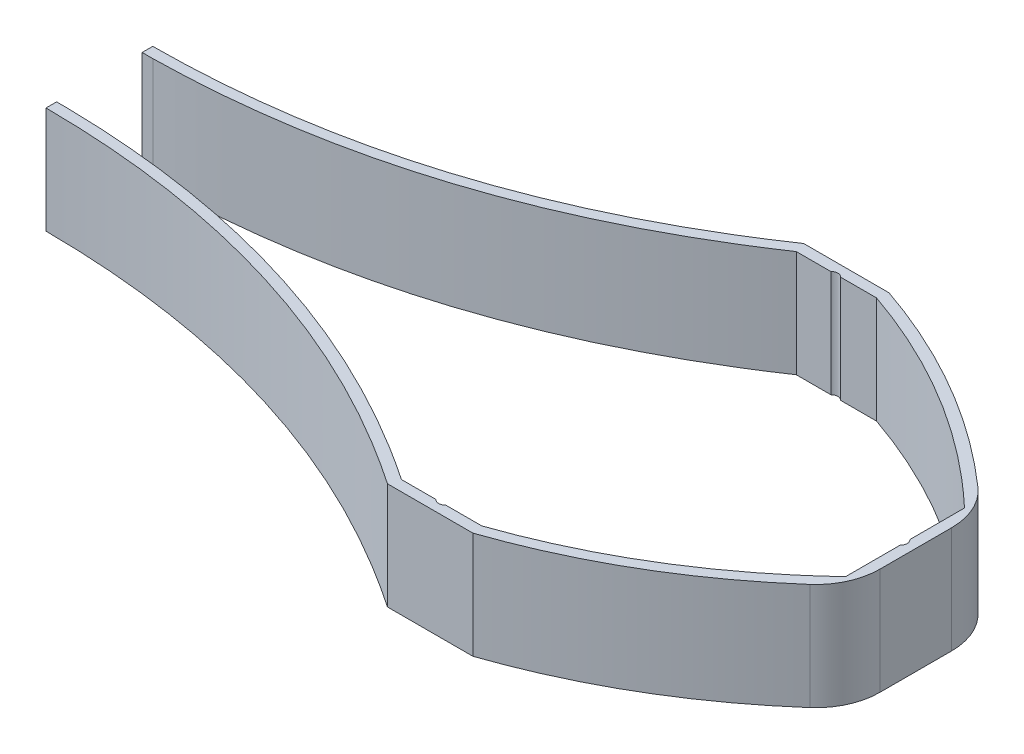
ISO-10303-21;
HEADER;
FILE_DESCRIPTION(('STEP AP214'),'2;1');
FILE_NAME('part.step','',(''),(''),'','','');
FILE_SCHEMA(('AUTOMOTIVE_DESIGN { 1 0 10303 214 1 1 1 1 }'));
ENDSEC;
DATA;
#1=APPLICATION_CONTEXT('core data for automotive mechanical design processes');
#2=APPLICATION_PROTOCOL_DEFINITION('international standard','automotive_design',2000,#1);
#3=PRODUCT_CONTEXT('',#1,'mechanical');
#4=PRODUCT('Part','Part','',(#3));
#5=PRODUCT_RELATED_PRODUCT_CATEGORY('part','',(#4));
#6=PRODUCT_DEFINITION_FORMATION('','',#4);
#7=PRODUCT_DEFINITION_CONTEXT('part definition',#1,'design');
#8=PRODUCT_DEFINITION('design','',#6,#7);
#9=PRODUCT_DEFINITION_SHAPE('','',#8);
#10=(LENGTH_UNIT() NAMED_UNIT(*) SI_UNIT(.MILLI.,.METRE.));
#11=(NAMED_UNIT(*) PLANE_ANGLE_UNIT() SI_UNIT($,.RADIAN.));
#12=(NAMED_UNIT(*) SI_UNIT($,.STERADIAN.) SOLID_ANGLE_UNIT());
#13=UNCERTAINTY_MEASURE_WITH_UNIT(LENGTH_MEASURE(1.E-05),#10,'distance_accuracy_value','');
#14=(GEOMETRIC_REPRESENTATION_CONTEXT(3) GLOBAL_UNCERTAINTY_ASSIGNED_CONTEXT((#13)) GLOBAL_UNIT_ASSIGNED_CONTEXT((#10,
#11,#12)) REPRESENTATION_CONTEXT('',''));
#15=CARTESIAN_POINT('',(0.,0.,0.));
#16=DIRECTION('',(0.,0.,1.));
#17=DIRECTION('',(1.,0.,0.));
#18=AXIS2_PLACEMENT_3D('',#15,#16,#17);
#19=CARTESIAN_POINT('',(9.58146848757706,12.5,-46.2499999999991));
#20=CARTESIAN_POINT('',(12.0353670859021,12.5,-45.4008110443861));
#21=CARTESIAN_POINT('',(16.9097221929911,12.5,-43.5681048512223));
#22=CARTESIAN_POINT('',(26.3642553760684,12.5,-39.4212784067116));
#23=CARTESIAN_POINT('',(35.4402433680855,12.5,-34.5305904416933));
#24=CARTESIAN_POINT('',(44.1275730370916,12.5,-28.8994345598037));
#25=CARTESIAN_POINT('',(50.4548694112389,12.5,-24.3012249254233));
#26=CARTESIAN_POINT('',(56.5810646239347,12.5,-19.3397855703037));
#27=CARTESIAN_POINT('',(60.5640959219903,12.5,-15.7585691193844));
#28=CARTESIAN_POINT('',(62.4999999999999,12.5,-13.9281321530195));
#29=B_SPLINE_CURVE_WITH_KNOTS('',3,(#19,#20,#21,#22,#23,#24,#25,#26,#27,#28),.UNSPECIFIED.,.F.,
.F.,(4,1,1,1,1,1,1,4),(0.0161274594529509,0.138301121351212,0.260474783249474,0.504822107045996,
0.626995768944257,0.749169430842519,0.87134309274078,0.993516754639041),.UNSPECIFIED.);
#30=DIRECTION('',(0.,-1.,0.));
#31=VECTOR('',#30,1.);
#32=SURFACE_OF_LINEAR_EXTRUSION('',#29,#31);
#33=DIRECTION('',(0.,-1.,0.));
#34=VECTOR('',#33,1.);
#35=CARTESIAN_POINT('',(9.58146848757706,12.5,-46.2499999999991));
#36=LINE('',#35,#34);
#37=CARTESIAN_POINT('',(9.58146848757706,12.5,-46.2499999999991));
#38=VERTEX_POINT('',#37);
#39=CARTESIAN_POINT('',(9.58146848757706,-12.5,-46.2499999999991));
#40=VERTEX_POINT('',#39);
#41=EDGE_CURVE('E399',#38,#40,#36,.T.);
#42=ORIENTED_EDGE('',*,*,#41,.T.);
#43=CARTESIAN_POINT('',(9.58146848757706,-12.5,-46.2499999999991));
#44=CARTESIAN_POINT('',(12.0353670859021,-12.5,-45.4008110443861));
#45=CARTESIAN_POINT('',(16.9097221929911,-12.5,-43.5681048512223));
#46=CARTESIAN_POINT('',(26.3642553760684,-12.5,-39.4212784067116));
#47=CARTESIAN_POINT('',(35.4402433680855,-12.5,-34.5305904416933));
#48=CARTESIAN_POINT('',(44.1275730370916,-12.5,-28.8994345598037));
#49=CARTESIAN_POINT('',(50.4548694112389,-12.5,-24.3012249254233));
#50=CARTESIAN_POINT('',(56.5810646239347,-12.5,-19.3397855703037));
#51=CARTESIAN_POINT('',(60.5640959219903,-12.5,-15.7585691193844));
#52=CARTESIAN_POINT('',(62.4999999999999,-12.5,-13.9281321530195));
#53=B_SPLINE_CURVE_WITH_KNOTS('',3,(#43,#44,#45,#46,#47,#48,#49,#50,#51,#52),.UNSPECIFIED.,.F.,
.F.,(4,1,1,1,1,1,1,4),(0.0161274594529509,0.138301121351212,0.260474783249474,0.504822107045996,
0.626995768944257,0.749169430842519,0.87134309274078,0.993516754639041),.UNSPECIFIED.);
#54=CARTESIAN_POINT('',(62.4999999999998,-12.5,-13.9281321530195));
#55=VERTEX_POINT('',#54);
#56=EDGE_CURVE('E334',#40,#55,#53,.T.);
#57=ORIENTED_EDGE('',*,*,#56,.T.);
#58=DIRECTION('',(0.,-1.,0.));
#59=VECTOR('',#58,1.);
#60=CARTESIAN_POINT('',(62.4999999999998,12.5,-13.9281321530195));
#61=LINE('',#60,#59);
#62=CARTESIAN_POINT('',(62.4999999999998,12.5,-13.9281321530195));
#63=VERTEX_POINT('',#62);
#64=EDGE_CURVE('E397',#63,#55,#61,.T.);
#65=ORIENTED_EDGE('',*,*,#64,.F.);
#66=EDGE_CURVE('E384',#38,#63,#29,.T.);
#67=ORIENTED_EDGE('',*,*,#66,.F.);
#68=EDGE_LOOP('',(#42,#57,#65,#67));
#69=FACE_BOUND('',#68,.T.);
#70=ADVANCED_FACE('F36',(#69),#32,.F.);
#71=CARTESIAN_POINT('',(0.,12.5,48.75));
#72=DIRECTION('',(0.,0.,-1.));
#73=DIRECTION('',(-1.,0.,0.));
#74=AXIS2_PLACEMENT_3D('',#71,#72,#73);
#75=PLANE('',#74);
#76=DIRECTION('',(1.,0.,0.));
#77=VECTOR('',#76,1.);
#78=CARTESIAN_POINT('',(0.,12.5,48.75));
#79=LINE('',#78,#77);
#80=CARTESIAN_POINT('',(-10.,12.5,48.75));
#81=VERTEX_POINT('',#80);
#82=CARTESIAN_POINT('',(10.,12.5,48.75));
#83=VERTEX_POINT('',#82);
#84=EDGE_CURVE('E483',#81,#83,#79,.T.);
#85=ORIENTED_EDGE('',*,*,#84,.F.);
#86=DIRECTION('',(0.,1.,0.));
#87=VECTOR('',#86,1.);
#88=CARTESIAN_POINT('',(-10.,-12.5,48.75));
#89=LINE('',#88,#87);
#90=CARTESIAN_POINT('',(-10.,-12.5,48.75));
#91=VERTEX_POINT('',#90);
#92=EDGE_CURVE('E588',#91,#81,#89,.T.);
#93=ORIENTED_EDGE('',*,*,#92,.F.);
#94=DIRECTION('',(1.,0.,0.));
#95=VECTOR('',#94,1.);
#96=CARTESIAN_POINT('',(0.,-12.5,48.75));
#97=LINE('',#96,#95);
#98=CARTESIAN_POINT('',(10.,-12.5,48.75));
#99=VERTEX_POINT('',#98);
#100=EDGE_CURVE('E459',#91,#99,#97,.T.);
#101=ORIENTED_EDGE('',*,*,#100,.T.);
#102=DIRECTION('',(0.,-1.,0.));
#103=VECTOR('',#102,1.);
#104=CARTESIAN_POINT('',(10.,12.5,48.75));
#105=LINE('',#104,#103);
#106=EDGE_CURVE('E295',#83,#99,#105,.T.);
#107=ORIENTED_EDGE('',*,*,#106,.F.);
#108=EDGE_LOOP('',(#85,#93,#101,#107));
#109=FACE_BOUND('',#108,.T.);
#110=ADVANCED_FACE('F369',(#109),#75,.F.);
#111=CARTESIAN_POINT('',(65.,12.5,15.));
#112=CARTESIAN_POINT('',(40.7961357215202,12.5,38.1894459944229));
#113=CARTESIAN_POINT('',(9.99999999999999,12.5,48.75));
#114=B_SPLINE_CURVE_WITH_KNOTS('',2,(#111,#112,#113),.UNSPECIFIED.,.F.,.F.,(3,3),(0.,1.),.UNSPECIFIED.);
#115=DIRECTION('',(0.,-1.,0.));
#116=VECTOR('',#115,1.);
#117=SURFACE_OF_LINEAR_EXTRUSION('',#114,#116);
#118=CARTESIAN_POINT('',(65.,-12.5,15.));
#119=CARTESIAN_POINT('',(40.7961357215202,-12.5,38.1894459944229));
#120=CARTESIAN_POINT('',(9.99999999999999,-12.5,48.75));
#121=B_SPLINE_CURVE_WITH_KNOTS('',2,(#118,#119,#120),.UNSPECIFIED.,.F.,.F.,(3,3),(0.,1.),.UNSPECIFIED.);
#122=CARTESIAN_POINT('',(59.9034771325571,-12.5,19.6787389279606));
#123=VERTEX_POINT('',#122);
#124=EDGE_CURVE('E451',#123,#99,#121,.T.);
#125=ORIENTED_EDGE('',*,*,#124,.F.);
#126=DIRECTION('',(0.,-1.,0.));
#127=VECTOR('',#126,1.);
#128=CARTESIAN_POINT('',(59.9034771325552,-12.5,19.6787389279622));
#129=LINE('',#128,#127);
#130=CARTESIAN_POINT('',(59.9034771325552,12.5,19.6787389279622));
#131=VERTEX_POINT('',#130);
#132=EDGE_CURVE('E417',#123,#131,#129,.F.);
#133=ORIENTED_EDGE('',*,*,#132,.T.);
#134=EDGE_CURVE('E427',#131,#83,#114,.T.);
#135=ORIENTED_EDGE('',*,*,#134,.T.);
#136=ORIENTED_EDGE('',*,*,#106,.T.);
#137=EDGE_LOOP('',(#125,#133,#135,#136));
#138=FACE_BOUND('',#137,.T.);
#139=ADVANCED_FACE('F375',(#138),#117,.T.);
#140=CARTESIAN_POINT('',(50.,12.5,8.4128106180112));
#141=DIRECTION('',(0.,-1.,0.));
#142=DIRECTION('',(0.,0.,-1.));
#143=AXIS2_PLACEMENT_3D('',#140,#141,#142);
#144=CYLINDRICAL_SURFACE('',#143,15.);
#145=DIRECTION('',(0.,1.,0.));
#146=VECTOR('',#145,1.);
#147=CARTESIAN_POINT('',(65.,12.5,8.4128106180112));
#148=LINE('',#147,#146);
#149=CARTESIAN_POINT('',(65.,12.5,8.4128106180112));
#150=VERTEX_POINT('',#149);
#151=CARTESIAN_POINT('',(65.,-12.5,8.4128106180112));
#152=VERTEX_POINT('',#151);
#153=EDGE_CURVE('E414',#150,#152,#148,.F.);
#154=ORIENTED_EDGE('',*,*,#153,.F.);
#155=CARTESIAN_POINT('',(50.,12.5,8.4128106180112));
#156=DIRECTION('',(0.,1.,0.));
#157=DIRECTION('',(0.,0.,1.));
#158=AXIS2_PLACEMENT_3D('',#155,#156,#157);
#159=CIRCLE('',#158,15.);
#160=EDGE_CURVE('E44',#131,#150,#159,.T.);
#161=ORIENTED_EDGE('',*,*,#160,.F.);
#162=ORIENTED_EDGE('',*,*,#132,.F.);
#163=CARTESIAN_POINT('',(50.,-12.5,8.4128106180112));
#164=DIRECTION('',(0.,1.,0.));
#165=DIRECTION('',(0.,0.,1.));
#166=AXIS2_PLACEMENT_3D('',#163,#164,#165);
#167=CIRCLE('',#166,15.);
#168=EDGE_CURVE('E11',#152,#123,#167,.F.);
#169=ORIENTED_EDGE('',*,*,#168,.F.);
#170=EDGE_LOOP('',(#154,#161,#162,#169));
#171=FACE_BOUND('',#170,.T.);
#172=ADVANCED_FACE('F38',(#171),#144,.T.);
#173=CARTESIAN_POINT('',(65.,12.5,0.));
#174=DIRECTION('',(-1.,0.,0.));
#175=DIRECTION('',(0.,0.,1.));
#176=AXIS2_PLACEMENT_3D('',#173,#174,#175);
#177=PLANE('',#176);
#178=DIRECTION('',(0.,0.,-1.));
#179=VECTOR('',#178,1.);
#180=CARTESIAN_POINT('',(65.,12.5,0.));
#181=LINE('',#180,#179);
#182=CARTESIAN_POINT('',(65.,12.5,-8.4128106180112));
#183=VERTEX_POINT('',#182);
#184=EDGE_CURVE('E424',#150,#183,#181,.T.);
#185=ORIENTED_EDGE('',*,*,#184,.F.);
#186=ORIENTED_EDGE('',*,*,#153,.T.);
#187=DIRECTION('',(0.,0.,-1.));
#188=VECTOR('',#187,1.);
#189=CARTESIAN_POINT('',(65.,-12.5,0.));
#190=LINE('',#189,#188);
#191=CARTESIAN_POINT('',(65.,-12.5,-8.41281061801119));
#192=VERTEX_POINT('',#191);
#193=EDGE_CURVE('E329',#152,#192,#190,.T.);
#194=ORIENTED_EDGE('',*,*,#193,.T.);
#195=DIRECTION('',(0.,-1.,0.));
#196=VECTOR('',#195,1.);
#197=CARTESIAN_POINT('',(65.,12.5,-8.41281061801121));
#198=LINE('',#197,#196);
#199=EDGE_CURVE('E401',#192,#183,#198,.F.);
#200=ORIENTED_EDGE('',*,*,#199,.T.);
#201=EDGE_LOOP('',(#185,#186,#194,#200));
#202=FACE_BOUND('',#201,.T.);
#203=ADVANCED_FACE('F361',(#202),#177,.F.);
#204=CARTESIAN_POINT('',(50.,-12.5,-8.41281061801121));
#205=DIRECTION('',(0.,-1.,0.));
#206=DIRECTION('',(0.,0.,-1.));
#207=AXIS2_PLACEMENT_3D('',#204,#205,#206);
#208=CYLINDRICAL_SURFACE('',#207,15.);
#209=ORIENTED_EDGE('',*,*,#199,.F.);
#210=CARTESIAN_POINT('',(50.,-12.5,-8.41281061801121));
#211=DIRECTION('',(0.,1.,0.));
#212=DIRECTION('',(0.,0.,1.));
#213=AXIS2_PLACEMENT_3D('',#210,#211,#212);
#214=CIRCLE('',#213,15.);
#215=CARTESIAN_POINT('',(59.9034771325552,-12.5,-19.6787389279622));
#216=VERTEX_POINT('',#215);
#217=EDGE_CURVE('E409',#216,#192,#214,.F.);
#218=ORIENTED_EDGE('',*,*,#217,.F.);
#219=DIRECTION('',(0.,-1.,0.));
#220=VECTOR('',#219,1.);
#221=CARTESIAN_POINT('',(59.9034771325552,12.5,-19.6787389279622));
#222=LINE('',#221,#220);
#223=CARTESIAN_POINT('',(59.9034771325571,12.5,-19.6787389279606));
#224=VERTEX_POINT('',#223);
#225=EDGE_CURVE('E406',#224,#216,#222,.T.);
#226=ORIENTED_EDGE('',*,*,#225,.F.);
#227=CARTESIAN_POINT('',(50.,12.5,-8.41281061801121));
#228=DIRECTION('',(0.,1.,0.));
#229=DIRECTION('',(0.,0.,1.));
#230=AXIS2_PLACEMENT_3D('',#227,#228,#229);
#231=CIRCLE('',#230,15.);
#232=EDGE_CURVE('E412',#183,#224,#231,.T.);
#233=ORIENTED_EDGE('',*,*,#232,.F.);
#234=EDGE_LOOP('',(#209,#218,#226,#233));
#235=FACE_BOUND('',#234,.T.);
#236=ADVANCED_FACE('F357',(#235),#208,.T.);
#237=CARTESIAN_POINT('',(65.,12.5,-15.));
#238=CARTESIAN_POINT('',(40.7961357215202,12.5,-38.1894459944229));
#239=CARTESIAN_POINT('',(9.99999999999999,12.5,-48.75));
#240=B_SPLINE_CURVE_WITH_KNOTS('',2,(#237,#238,#239),.UNSPECIFIED.,.F.,.F.,(3,3),(0.,1.),.UNSPECIFIED.);
#241=DIRECTION('',(0.,-1.,0.));
#242=VECTOR('',#241,1.);
#243=SURFACE_OF_LINEAR_EXTRUSION('',#240,#242);
#244=CARTESIAN_POINT('',(10.,12.5,-48.75));
#245=VERTEX_POINT('',#244);
#246=EDGE_CURVE('E343',#224,#245,#240,.T.);
#247=ORIENTED_EDGE('',*,*,#246,.F.);
#248=ORIENTED_EDGE('',*,*,#225,.T.);
#249=CARTESIAN_POINT('',(65.,-12.5,-15.));
#250=CARTESIAN_POINT('',(40.7961357215202,-12.5,-38.1894459944229));
#251=CARTESIAN_POINT('',(9.99999999999999,-12.5,-48.75));
#252=B_SPLINE_CURVE_WITH_KNOTS('',2,(#249,#250,#251),.UNSPECIFIED.,.F.,.F.,(3,3),(0.,1.),.UNSPECIFIED.);
#253=CARTESIAN_POINT('',(10.,-12.5,-48.75));
#254=VERTEX_POINT('',#253);
#255=EDGE_CURVE('E311',#216,#254,#252,.T.);
#256=ORIENTED_EDGE('',*,*,#255,.T.);
#257=DIRECTION('',(0.,-1.,0.));
#258=VECTOR('',#257,1.);
#259=CARTESIAN_POINT('',(10.,12.5,-48.75));
#260=LINE('',#259,#258);
#261=EDGE_CURVE('E396',#245,#254,#260,.T.);
#262=ORIENTED_EDGE('',*,*,#261,.F.);
#263=EDGE_LOOP('',(#247,#248,#256,#262));
#264=FACE_BOUND('',#263,.T.);
#265=ADVANCED_FACE('F354',(#264),#243,.F.);
#266=CARTESIAN_POINT('',(0.,12.5,-48.75));
#267=DIRECTION('',(0.,0.,-1.));
#268=DIRECTION('',(-1.,0.,0.));
#269=AXIS2_PLACEMENT_3D('',#266,#267,#268);
#270=PLANE('',#269);
#271=ORIENTED_EDGE('',*,*,#261,.T.);
#272=DIRECTION('',(1.,0.,0.));
#273=VECTOR('',#272,1.);
#274=CARTESIAN_POINT('',(0.,-12.5,-48.75));
#275=LINE('',#274,#273);
#276=CARTESIAN_POINT('',(-10.,-12.5,-48.75));
#277=VERTEX_POINT('',#276);
#278=EDGE_CURVE('E323',#277,#254,#275,.T.);
#279=ORIENTED_EDGE('',*,*,#278,.F.);
#280=DIRECTION('',(0.,1.,0.));
#281=VECTOR('',#280,1.);
#282=CARTESIAN_POINT('',(-10.,-12.5,-48.75));
#283=LINE('',#282,#281);
#284=CARTESIAN_POINT('',(-10.,12.5,-48.75));
#285=VERTEX_POINT('',#284);
#286=EDGE_CURVE('E436',#277,#285,#283,.T.);
#287=ORIENTED_EDGE('',*,*,#286,.T.);
#288=DIRECTION('',(1.,0.,0.));
#289=VECTOR('',#288,1.);
#290=CARTESIAN_POINT('',(0.,12.5,-48.75));
#291=LINE('',#290,#289);
#292=EDGE_CURVE('E348',#285,#245,#291,.T.);
#293=ORIENTED_EDGE('',*,*,#292,.T.);
#294=EDGE_LOOP('',(#271,#279,#287,#293));
#295=FACE_BOUND('',#294,.T.);
#296=ADVANCED_FACE('F284',(#295),#270,.T.);
#297=CARTESIAN_POINT('',(9.58146848757706,12.5,46.2499999999991));
#298=CARTESIAN_POINT('',(12.0353670859021,12.5,45.4008110443861));
#299=CARTESIAN_POINT('',(16.9097221929911,12.5,43.5681048512223));
#300=CARTESIAN_POINT('',(26.3642553760684,12.5,39.4212784067116));
#301=CARTESIAN_POINT('',(35.4402433680855,12.5,34.5305904416933));
#302=CARTESIAN_POINT('',(44.1275730370916,12.5,28.8994345598037));
#303=CARTESIAN_POINT('',(50.4548694112389,12.5,24.3012249254233));
#304=CARTESIAN_POINT('',(56.5810646239347,12.5,19.3397855703037));
#305=CARTESIAN_POINT('',(60.5640959219903,12.5,15.7585691193844));
#306=CARTESIAN_POINT('',(62.4999999999999,12.5,13.9281321530195));
#307=B_SPLINE_CURVE_WITH_KNOTS('',3,(#297,#298,#299,#300,#301,#302,#303,#304,#305,#306),
.UNSPECIFIED.,.F.,.F.,(4,1,1,1,1,1,1,4),(0.0161274594529509,0.138301121351212,0.260474783249474,
0.504822107045996,0.626995768944257,0.749169430842519,0.87134309274078,0.993516754639041),.UNSPECIFIED.);
#308=DIRECTION('',(0.,-1.,0.));
#309=VECTOR('',#308,1.);
#310=SURFACE_OF_LINEAR_EXTRUSION('',#307,#309);
#311=DIRECTION('',(0.,-1.,0.));
#312=VECTOR('',#311,1.);
#313=CARTESIAN_POINT('',(62.4999999999998,12.5,13.9281321530195));
#314=LINE('',#313,#312);
#315=CARTESIAN_POINT('',(62.4999999999998,12.5,13.9281321530195));
#316=VERTEX_POINT('',#315);
#317=CARTESIAN_POINT('',(62.4999999999998,-12.5,13.9281321530195));
#318=VERTEX_POINT('',#317);
#319=EDGE_CURVE('E303',#316,#318,#314,.T.);
#320=ORIENTED_EDGE('',*,*,#319,.T.);
#321=CARTESIAN_POINT('',(9.58146848757706,-12.5,46.2499999999991));
#322=CARTESIAN_POINT('',(12.0353670859021,-12.5,45.4008110443861));
#323=CARTESIAN_POINT('',(16.9097221929911,-12.5,43.5681048512223));
#324=CARTESIAN_POINT('',(26.3642553760684,-12.5,39.4212784067116));
#325=CARTESIAN_POINT('',(35.4402433680855,-12.5,34.5305904416933));
#326=CARTESIAN_POINT('',(44.1275730370916,-12.5,28.8994345598037));
#327=CARTESIAN_POINT('',(50.4548694112389,-12.5,24.3012249254233));
#328=CARTESIAN_POINT('',(56.5810646239347,-12.5,19.3397855703037));
#329=CARTESIAN_POINT('',(60.5640959219903,-12.5,15.7585691193844));
#330=CARTESIAN_POINT('',(62.4999999999999,-12.5,13.9281321530195));
#331=B_SPLINE_CURVE_WITH_KNOTS('',3,(#321,#322,#323,#324,#325,#326,#327,#328,#329,#330),
.UNSPECIFIED.,.F.,.F.,(4,1,1,1,1,1,1,4),(0.0161274594529509,0.138301121351212,0.260474783249474,
0.504822107045996,0.626995768944257,0.749169430842519,0.87134309274078,0.993516754639041),.UNSPECIFIED.);
#332=CARTESIAN_POINT('',(9.58146848757706,-12.5,46.2499999999991));
#333=VERTEX_POINT('',#332);
#334=EDGE_CURVE('E471',#333,#318,#331,.T.);
#335=ORIENTED_EDGE('',*,*,#334,.F.);
#336=DIRECTION('',(0.,-1.,0.));
#337=VECTOR('',#336,1.);
#338=CARTESIAN_POINT('',(9.58146848757706,12.5,46.2499999999991));
#339=LINE('',#338,#337);
#340=CARTESIAN_POINT('',(9.58146848757706,12.5,46.2499999999991));
#341=VERTEX_POINT('',#340);
#342=EDGE_CURVE('E298',#341,#333,#339,.T.);
#343=ORIENTED_EDGE('',*,*,#342,.F.);
#344=EDGE_CURVE('E288',#341,#316,#307,.T.);
#345=ORIENTED_EDGE('',*,*,#344,.T.);
#346=EDGE_LOOP('',(#320,#335,#343,#345));
#347=FACE_BOUND('',#346,.T.);
#348=ADVANCED_FACE('F273',(#347),#310,.T.);
#349=CARTESIAN_POINT('',(-126.25,-12.5,-12.5));
#350=CARTESIAN_POINT('',(-62.8537048693348,-12.5,-12.7779173309378));
#351=CARTESIAN_POINT('',(-10.,-12.5,-48.75));
#352=B_SPLINE_CURVE_WITH_KNOTS('',2,(#349,#350,#351),.UNSPECIFIED.,.F.,.F.,(3,3),(0.,1.),.UNSPECIFIED.);
#353=DIRECTION('',(0.,1.,0.));
#354=VECTOR('',#353,1.);
#355=SURFACE_OF_LINEAR_EXTRUSION('',#352,#354);
#356=DIRECTION('',(0.,1.,0.));
#357=VECTOR('',#356,1.);
#358=CARTESIAN_POINT('',(-126.25,-12.5,-12.5));
#359=LINE('',#358,#357);
#360=CARTESIAN_POINT('',(-126.25,-12.5,-12.5));
#361=VERTEX_POINT('',#360);
#362=CARTESIAN_POINT('',(-126.25,12.5,-12.5));
#363=VERTEX_POINT('',#362);
#364=EDGE_CURVE('E234',#361,#363,#359,.T.);
#365=ORIENTED_EDGE('',*,*,#364,.T.);
#366=CARTESIAN_POINT('',(-126.25,12.5,-12.5));
#367=CARTESIAN_POINT('',(-62.8537048693348,12.5,-12.7779173309378));
#368=CARTESIAN_POINT('',(-10.,12.5,-48.75));
#369=B_SPLINE_CURVE_WITH_KNOTS('',2,(#366,#367,#368),.UNSPECIFIED.,.F.,.F.,(3,3),(0.,1.),.UNSPECIFIED.);
#370=EDGE_CURVE('E439',#363,#285,#369,.T.);
#371=ORIENTED_EDGE('',*,*,#370,.T.);
#372=ORIENTED_EDGE('',*,*,#286,.F.);
#373=EDGE_CURVE('E237',#361,#277,#352,.T.);
#374=ORIENTED_EDGE('',*,*,#373,.F.);
#375=EDGE_LOOP('',(#365,#371,#372,#374));
#376=FACE_BOUND('',#375,.T.);
#377=ADVANCED_FACE('F269',(#376),#355,.F.);
#378=CARTESIAN_POINT('',(-126.25,-12.5,12.5));
#379=CARTESIAN_POINT('',(-62.8537048693348,-12.5,12.7779173309378));
#380=CARTESIAN_POINT('',(-10.,-12.5,48.75));
#381=B_SPLINE_CURVE_WITH_KNOTS('',2,(#378,#379,#380),.UNSPECIFIED.,.F.,.F.,(3,3),(0.,1.),.UNSPECIFIED.);
#382=DIRECTION('',(0.,1.,0.));
#383=VECTOR('',#382,1.);
#384=SURFACE_OF_LINEAR_EXTRUSION('',#381,#383);
#385=ORIENTED_EDGE('',*,*,#92,.T.);
#386=CARTESIAN_POINT('',(-126.25,12.5,12.5));
#387=CARTESIAN_POINT('',(-62.8537048693348,12.5,12.7779173309378));
#388=CARTESIAN_POINT('',(-10.,12.5,48.75));
#389=B_SPLINE_CURVE_WITH_KNOTS('',2,(#386,#387,#388),.UNSPECIFIED.,.F.,.F.,(3,3),(0.,1.),.UNSPECIFIED.);
#390=CARTESIAN_POINT('',(-126.25,12.5,12.5));
#391=VERTEX_POINT('',#390);
#392=EDGE_CURVE('E535',#391,#81,#389,.T.);
#393=ORIENTED_EDGE('',*,*,#392,.F.);
#394=DIRECTION('',(0.,1.,0.));
#395=VECTOR('',#394,1.);
#396=CARTESIAN_POINT('',(-126.25,-12.5,12.5));
#397=LINE('',#396,#395);
#398=CARTESIAN_POINT('',(-126.25,-12.5,12.5));
#399=VERTEX_POINT('',#398);
#400=EDGE_CURVE('E579',#399,#391,#397,.T.);
#401=ORIENTED_EDGE('',*,*,#400,.F.);
#402=EDGE_CURVE('E551',#399,#91,#381,.T.);
#403=ORIENTED_EDGE('',*,*,#402,.T.);
#404=EDGE_LOOP('',(#385,#393,#401,#403));
#405=FACE_BOUND('',#404,.T.);
#406=ADVANCED_FACE('F272',(#405),#384,.T.);
#407=CARTESIAN_POINT('',(0.,-12.5,-45.25));
#408=DIRECTION('',(0.,1.,0.));
#409=DIRECTION('',(0.,0.,1.));
#410=AXIS2_PLACEMENT_3D('',#407,#408,#409);
#411=CYLINDRICAL_SURFACE('',#410,1.5);
#412=CARTESIAN_POINT('',(0.,12.5,-45.25));
#413=DIRECTION('',(0.,1.,0.));
#414=DIRECTION('',(0.,0.,1.));
#415=AXIS2_PLACEMENT_3D('',#412,#413,#414);
#416=CIRCLE('',#415,1.5);
#417=CARTESIAN_POINT('',(1.11803398874989,12.5,-46.25));
#418=VERTEX_POINT('',#417);
#419=CARTESIAN_POINT('',(-1.1180339887499,12.5,-46.25));
#420=VERTEX_POINT('',#419);
#421=EDGE_CURVE('E312',#418,#420,#416,.T.);
#422=ORIENTED_EDGE('',*,*,#421,.T.);
#423=DIRECTION('',(0.,1.,0.));
#424=VECTOR('',#423,1.);
#425=CARTESIAN_POINT('',(-1.1180339887499,-12.5,-46.25));
#426=LINE('',#425,#424);
#427=CARTESIAN_POINT('',(-1.1180339887499,-12.5,-46.25));
#428=VERTEX_POINT('',#427);
#429=EDGE_CURVE('E522',#420,#428,#426,.F.);
#430=ORIENTED_EDGE('',*,*,#429,.T.);
#431=CARTESIAN_POINT('',(0.,-12.5,-45.25));
#432=DIRECTION('',(0.,1.,0.));
#433=DIRECTION('',(0.,0.,1.));
#434=AXIS2_PLACEMENT_3D('',#431,#432,#433);
#435=CIRCLE('',#434,1.5);
#436=CARTESIAN_POINT('',(1.11803398874989,-12.5,-46.25));
#437=VERTEX_POINT('',#436);
#438=EDGE_CURVE('E308',#437,#428,#435,.T.);
#439=ORIENTED_EDGE('',*,*,#438,.F.);
#440=DIRECTION('',(0.,1.,0.));
#441=VECTOR('',#440,1.);
#442=CARTESIAN_POINT('',(1.11803398874989,-12.5,-46.25));
#443=LINE('',#442,#441);
#444=EDGE_CURVE('E516',#437,#418,#443,.T.);
#445=ORIENTED_EDGE('',*,*,#444,.T.);
#446=EDGE_LOOP('',(#422,#430,#439,#445));
#447=FACE_BOUND('',#446,.T.);
#448=ADVANCED_FACE('F491',(#447),#411,.F.);
#449=CARTESIAN_POINT('',(61.5,-12.5,0.));
#450=DIRECTION('',(0.,1.,0.));
#451=DIRECTION('',(0.,0.,1.));
#452=AXIS2_PLACEMENT_3D('',#449,#450,#451);
#453=CYLINDRICAL_SURFACE('',#452,1.5);
#454=CARTESIAN_POINT('',(61.5,12.5,0.));
#455=DIRECTION('',(0.,1.,0.));
#456=DIRECTION('',(0.,0.,1.));
#457=AXIS2_PLACEMENT_3D('',#454,#455,#456);
#458=CIRCLE('',#457,1.5);
#459=CARTESIAN_POINT('',(62.5,12.5,1.1180339887499));
#460=VERTEX_POINT('',#459);
#461=CARTESIAN_POINT('',(62.5,12.5,-1.11803398874989));
#462=VERTEX_POINT('',#461);
#463=EDGE_CURVE('E315',#460,#462,#458,.T.);
#464=ORIENTED_EDGE('',*,*,#463,.T.);
#465=DIRECTION('',(0.,1.,0.));
#466=VECTOR('',#465,1.);
#467=CARTESIAN_POINT('',(62.5,-12.5,-1.11803398874989));
#468=LINE('',#467,#466);
#469=CARTESIAN_POINT('',(62.5,-12.5,-1.11803398874989));
#470=VERTEX_POINT('',#469);
#471=EDGE_CURVE('E528',#462,#470,#468,.F.);
#472=ORIENTED_EDGE('',*,*,#471,.T.);
#473=CARTESIAN_POINT('',(61.5,-12.5,0.));
#474=DIRECTION('',(0.,1.,0.));
#475=DIRECTION('',(0.,0.,1.));
#476=AXIS2_PLACEMENT_3D('',#473,#474,#475);
#477=CIRCLE('',#476,1.5);
#478=CARTESIAN_POINT('',(62.5,-12.5,1.1180339887499));
#479=VERTEX_POINT('',#478);
#480=EDGE_CURVE('E305',#479,#470,#477,.T.);
#481=ORIENTED_EDGE('',*,*,#480,.F.);
#482=DIRECTION('',(0.,1.,0.));
#483=VECTOR('',#482,1.);
#484=CARTESIAN_POINT('',(62.5,-12.5,1.1180339887499));
#485=LINE('',#484,#483);
#486=EDGE_CURVE('E525',#479,#460,#485,.T.);
#487=ORIENTED_EDGE('',*,*,#486,.T.);
#488=EDGE_LOOP('',(#464,#472,#481,#487));
#489=FACE_BOUND('',#488,.T.);
#490=ADVANCED_FACE('F494',(#489),#453,.F.);
#491=CARTESIAN_POINT('',(62.5,12.5,8.34867762301083E-13));
#492=DIRECTION('',(1.,0.,0.));
#493=DIRECTION('',(0.,0.,-1.));
#494=AXIS2_PLACEMENT_3D('',#491,#492,#493);
#495=PLANE('',#494);
#496=DIRECTION('',(0.,0.,1.));
#497=VECTOR('',#496,1.);
#498=CARTESIAN_POINT('',(62.5,12.5,8.34867762301083E-13));
#499=LINE('',#498,#497);
#500=EDGE_CURVE('E296',#460,#316,#499,.T.);
#501=ORIENTED_EDGE('',*,*,#500,.F.);
#502=ORIENTED_EDGE('',*,*,#486,.F.);
#503=DIRECTION('',(0.,0.,1.));
#504=VECTOR('',#503,1.);
#505=CARTESIAN_POINT('',(62.5,-12.5,8.34867762301083E-13));
#506=LINE('',#505,#504);
#507=EDGE_CURVE('E468',#479,#318,#506,.T.);
#508=ORIENTED_EDGE('',*,*,#507,.T.);
#509=ORIENTED_EDGE('',*,*,#319,.F.);
#510=EDGE_LOOP('',(#501,#502,#508,#509));
#511=FACE_BOUND('',#510,.T.);
#512=ADVANCED_FACE('F286',(#511),#495,.F.);
#513=CARTESIAN_POINT('',(6.0274039489532E-12,12.5,46.2500000000003));
#514=DIRECTION('',(-1.30322247544933E-13,0.,-1.));
#515=DIRECTION('',(-1.,0.,1.30322247544933E-13));
#516=AXIS2_PLACEMENT_3D('',#513,#514,#515);
#517=PLANE('',#516);
#518=ORIENTED_EDGE('',*,*,#342,.T.);
#519=DIRECTION('',(1.,0.,-1.30322247544933E-13));
#520=VECTOR('',#519,1.);
#521=CARTESIAN_POINT('',(6.0274039489532E-12,-12.5,46.2500000000003));
#522=LINE('',#521,#520);
#523=CARTESIAN_POINT('',(1.11803398874989,-12.5,46.25));
#524=VERTEX_POINT('',#523);
#525=EDGE_CURVE('E465',#524,#333,#522,.T.);
#526=ORIENTED_EDGE('',*,*,#525,.F.);
#527=DIRECTION('',(0.,1.,0.));
#528=VECTOR('',#527,1.);
#529=CARTESIAN_POINT('',(1.11803398874989,-12.5,46.25));
#530=LINE('',#529,#528);
#531=CARTESIAN_POINT('',(1.11803398874989,12.5,46.25));
#532=VERTEX_POINT('',#531);
#533=EDGE_CURVE('E530',#524,#532,#530,.T.);
#534=ORIENTED_EDGE('',*,*,#533,.T.);
#535=DIRECTION('',(1.,0.,-1.30322247544933E-13));
#536=VECTOR('',#535,1.);
#537=CARTESIAN_POINT('',(6.0274039489532E-12,12.5,46.2500000000003));
#538=LINE('',#537,#536);
#539=EDGE_CURVE('E624',#532,#341,#538,.T.);
#540=ORIENTED_EDGE('',*,*,#539,.T.);
#541=EDGE_LOOP('',(#518,#526,#534,#540));
#542=FACE_BOUND('',#541,.T.);
#543=ADVANCED_FACE('F279',(#542),#517,.T.);
#544=CARTESIAN_POINT('',(0.,-12.5,45.25));
#545=DIRECTION('',(0.,1.,0.));
#546=DIRECTION('',(0.,0.,1.));
#547=AXIS2_PLACEMENT_3D('',#544,#545,#546);
#548=CYLINDRICAL_SURFACE('',#547,1.5);
#549=ORIENTED_EDGE('',*,*,#533,.F.);
#550=CARTESIAN_POINT('',(0.,-12.5,45.25));
#551=DIRECTION('',(0.,-1.,0.));
#552=DIRECTION('',(0.,0.,-1.));
#553=AXIS2_PLACEMENT_3D('',#550,#551,#552);
#554=CIRCLE('',#553,1.5);
#555=CARTESIAN_POINT('',(-1.1180339887499,-12.5,46.25));
#556=VERTEX_POINT('',#555);
#557=EDGE_CURVE('E448',#524,#556,#554,.T.);
#558=ORIENTED_EDGE('',*,*,#557,.T.);
#559=DIRECTION('',(0.,1.,0.));
#560=VECTOR('',#559,1.);
#561=CARTESIAN_POINT('',(-1.1180339887499,-12.5,46.25));
#562=LINE('',#561,#560);
#563=CARTESIAN_POINT('',(-1.1180339887499,12.5,46.25));
#564=VERTEX_POINT('',#563);
#565=EDGE_CURVE('E616',#564,#556,#562,.F.);
#566=ORIENTED_EDGE('',*,*,#565,.F.);
#567=CARTESIAN_POINT('',(0.,12.5,45.25));
#568=DIRECTION('',(0.,-1.,0.));
#569=DIRECTION('',(0.,0.,-1.));
#570=AXIS2_PLACEMENT_3D('',#567,#568,#569);
#571=CIRCLE('',#570,1.5);
#572=EDGE_CURVE('E452',#532,#564,#571,.T.);
#573=ORIENTED_EDGE('',*,*,#572,.F.);
#574=EDGE_LOOP('',(#549,#558,#566,#573));
#575=FACE_BOUND('',#574,.T.);
#576=ADVANCED_FACE('F275',(#575),#548,.F.);
#577=CARTESIAN_POINT('',(2.65908687979967E-11,-12.5,46.2499999999986));
#578=DIRECTION('',(-5.74937703740487E-13,0.,-1.));
#579=DIRECTION('',(-1.,0.,5.74937703740487E-13));
#580=AXIS2_PLACEMENT_3D('',#577,#578,#579);
#581=PLANE('',#580);
#582=DIRECTION('',(0.,1.,0.));
#583=VECTOR('',#582,1.);
#584=CARTESIAN_POINT('',(-9.23223915828521,-12.5,46.2500000000039));
#585=LINE('',#584,#583);
#586=CARTESIAN_POINT('',(-9.23223915828521,-12.5,46.2500000000039));
#587=VERTEX_POINT('',#586);
#588=CARTESIAN_POINT('',(-9.23223915828521,12.5,46.2500000000039));
#589=VERTEX_POINT('',#588);
#590=EDGE_CURVE('E586',#587,#589,#585,.T.);
#591=ORIENTED_EDGE('',*,*,#590,.T.);
#592=DIRECTION('',(-1.,0.,5.74937703740486E-13));
#593=VECTOR('',#592,1.);
#594=CARTESIAN_POINT('',(2.65908687979967E-11,12.5,46.2499999999986));
#595=LINE('',#594,#593);
#596=EDGE_CURVE('E540',#564,#589,#595,.T.);
#597=ORIENTED_EDGE('',*,*,#596,.F.);
#598=ORIENTED_EDGE('',*,*,#565,.T.);
#599=DIRECTION('',(-1.,0.,5.74937703740486E-13));
#600=VECTOR('',#599,1.);
#601=CARTESIAN_POINT('',(2.65908687979967E-11,-12.5,46.2499999999986));
#602=LINE('',#601,#600);
#603=EDGE_CURVE('E560',#556,#587,#602,.T.);
#604=ORIENTED_EDGE('',*,*,#603,.T.);
#605=EDGE_LOOP('',(#591,#597,#598,#604));
#606=FACE_BOUND('',#605,.T.);
#607=ADVANCED_FACE('F278',(#606),#581,.T.);
#608=CARTESIAN_POINT('',(-123.75,-12.5,10.0246009888943));
#609=CARTESIAN_POINT('',(-121.166874207092,-12.5,10.0643345153506));
#610=CARTESIAN_POINT('',(-115.985751373709,-12.5,10.2337151464807));
#611=CARTESIAN_POINT('',(-105.76837077207,-12.5,10.9291995115294));
#612=CARTESIAN_POINT('',(-93.1751134819954,-12.5,12.4691907182085));
#613=CARTESIAN_POINT('',(-78.3809752020411,-12.5,15.3904073654233));
#614=CARTESIAN_POINT('',(-63.8998861555932,-12.5,19.3848477886227));
#615=CARTESIAN_POINT('',(-49.736452339355,-12.5,24.4521227803461));
#616=CARTESIAN_POINT('',(-35.8948534872913,-12.5,30.5895406567414));
#617=CARTESIAN_POINT('',(-24.6242529832426,-12.5,36.5984558055361));
#618=CARTESIAN_POINT('',(-15.7808444559141,-12.5,41.9317988615675));
#619=CARTESIAN_POINT('',(-11.3934395039747,-12.5,44.7895548065345));
#620=CARTESIAN_POINT('',(-9.23223915828521,-12.5,46.2500000000039));
#621=B_SPLINE_CURVE_WITH_KNOTS('',3,(#608,#609,#610,#611,#612,#613,#614,#615,#616,#617,#618,
#619,#620),.UNSPECIFIED.,.F.,.F.,(4,1,1,1,1,1,1,1,1,1,4),(0.0194454271130439,0.0803566389114738,
0.141267850709904,0.263090274306763,0.384912697903623,0.506735121500483,0.628557545097343,
0.750379968694202,0.872202392291062,0.933113604089492,0.994024815887922),.UNSPECIFIED.);
#622=DIRECTION('',(0.,1.,0.));
#623=VECTOR('',#622,1.);
#624=SURFACE_OF_LINEAR_EXTRUSION('',#621,#623);
#625=DIRECTION('',(0.,1.,0.));
#626=VECTOR('',#625,1.);
#627=CARTESIAN_POINT('',(-123.75,-12.5,10.0246009888943));
#628=LINE('',#627,#626);
#629=CARTESIAN_POINT('',(-123.75,-12.5,10.0246009888943));
#630=VERTEX_POINT('',#629);
#631=CARTESIAN_POINT('',(-123.75,12.5,10.0246009888943));
#632=VERTEX_POINT('',#631);
#633=EDGE_CURVE('E580',#630,#632,#628,.T.);
#634=ORIENTED_EDGE('',*,*,#633,.T.);
#635=CARTESIAN_POINT('',(-123.75,12.5,10.0246009888943));
#636=CARTESIAN_POINT('',(-121.166874207092,12.5,10.0643345153506));
#637=CARTESIAN_POINT('',(-115.985751373709,12.5,10.2337151464807));
#638=CARTESIAN_POINT('',(-105.76837077207,12.5,10.9291995115294));
#639=CARTESIAN_POINT('',(-93.1751134819954,12.5,12.4691907182085));
#640=CARTESIAN_POINT('',(-78.3809752020411,12.5,15.3904073654233));
#641=CARTESIAN_POINT('',(-63.8998861555932,12.5,19.3848477886227));
#642=CARTESIAN_POINT('',(-49.736452339355,12.5,24.4521227803461));
#643=CARTESIAN_POINT('',(-35.8948534872913,12.5,30.5895406567414));
#644=CARTESIAN_POINT('',(-24.6242529832426,12.5,36.5984558055361));
#645=CARTESIAN_POINT('',(-15.7808444559141,12.5,41.9317988615675));
#646=CARTESIAN_POINT('',(-11.3934395039747,12.5,44.7895548065345));
#647=CARTESIAN_POINT('',(-9.23223915828521,12.5,46.2500000000039));
#648=B_SPLINE_CURVE_WITH_KNOTS('',3,(#635,#636,#637,#638,#639,#640,#641,#642,#643,#644,#645,
#646,#647),.UNSPECIFIED.,.F.,.F.,(4,1,1,1,1,1,1,1,1,1,4),(0.0194454271130439,0.0803566389114738,
0.141267850709904,0.263090274306763,0.384912697903623,0.506735121500483,0.628557545097343,
0.750379968694202,0.872202392291062,0.933113604089492,0.994024815887922),.UNSPECIFIED.);
#649=EDGE_CURVE('E546',#632,#589,#648,.T.);
#650=ORIENTED_EDGE('',*,*,#649,.T.);
#651=ORIENTED_EDGE('',*,*,#590,.F.);
#652=EDGE_CURVE('E574',#630,#587,#621,.T.);
#653=ORIENTED_EDGE('',*,*,#652,.F.);
#654=EDGE_LOOP('',(#634,#650,#651,#653));
#655=FACE_BOUND('',#654,.T.);
#656=ADVANCED_FACE('F267',(#655),#624,.F.);
#657=CARTESIAN_POINT('',(-126.25,-12.5,0.));
#658=DIRECTION('',(1.,0.,0.));
#659=DIRECTION('',(0.,0.,-1.));
#660=AXIS2_PLACEMENT_3D('',#657,#658,#659);
#661=PLANE('',#660);
#662=DIRECTION('',(0.,0.,-1.));
#663=VECTOR('',#662,1.);
#664=CARTESIAN_POINT('',(-126.25,12.5,0.));
#665=LINE('',#664,#663);
#666=CARTESIAN_POINT('',(-126.25,12.5,10.0246009888943));
#667=VERTEX_POINT('',#666);
#668=EDGE_CURVE('E597',#391,#667,#665,.T.);
#669=ORIENTED_EDGE('',*,*,#668,.T.);
#670=DIRECTION('',(0.,1.,0.));
#671=VECTOR('',#670,1.);
#672=CARTESIAN_POINT('',(-126.25,-12.5,10.0246009888943));
#673=LINE('',#672,#671);
#674=CARTESIAN_POINT('',(-126.25,-12.5,10.0246009888943));
#675=VERTEX_POINT('',#674);
#676=EDGE_CURVE('E220',#675,#667,#673,.T.);
#677=ORIENTED_EDGE('',*,*,#676,.F.);
#678=DIRECTION('',(0.,0.,-1.));
#679=VECTOR('',#678,1.);
#680=CARTESIAN_POINT('',(-126.25,-12.5,0.));
#681=LINE('',#680,#679);
#682=EDGE_CURVE('E236',#399,#675,#681,.T.);
#683=ORIENTED_EDGE('',*,*,#682,.F.);
#684=ORIENTED_EDGE('',*,*,#400,.T.);
#685=EDGE_LOOP('',(#669,#677,#683,#684));
#686=FACE_BOUND('',#685,.T.);
#687=ADVANCED_FACE('F264',(#686),#661,.F.);
#688=CARTESIAN_POINT('',(-126.25,-12.5,-10.0246009888943));
#689=VERTEX_POINT('',#688);
#690=EDGE_CURVE('E227',#689,#361,#681,.T.);
#691=ORIENTED_EDGE('',*,*,#690,.F.);
#692=DIRECTION('',(0.,1.,0.));
#693=VECTOR('',#692,1.);
#694=CARTESIAN_POINT('',(-126.25,-12.5,-10.0246009888943));
#695=LINE('',#694,#693);
#696=CARTESIAN_POINT('',(-126.25,12.5,-10.0246009888943));
#697=VERTEX_POINT('',#696);
#698=EDGE_CURVE('E210',#689,#697,#695,.T.);
#699=ORIENTED_EDGE('',*,*,#698,.T.);
#700=EDGE_CURVE('E596',#697,#363,#665,.T.);
#701=ORIENTED_EDGE('',*,*,#700,.T.);
#702=ORIENTED_EDGE('',*,*,#364,.F.);
#703=EDGE_LOOP('',(#691,#699,#701,#702));
#704=FACE_BOUND('',#703,.T.);
#705=ADVANCED_FACE('F232',(#704),#661,.F.);
#706=CARTESIAN_POINT('',(-123.75,-12.5,-10.0246009888943));
#707=CARTESIAN_POINT('',(-121.166874207092,-12.5,-10.0643345153506));
#708=CARTESIAN_POINT('',(-115.985751373709,-12.5,-10.2337151464807));
#709=CARTESIAN_POINT('',(-105.76837077207,-12.5,-10.9291995115294));
#710=CARTESIAN_POINT('',(-93.1751134819954,-12.5,-12.4691907182085));
#711=CARTESIAN_POINT('',(-78.3809752020411,-12.5,-15.3904073654233));
#712=CARTESIAN_POINT('',(-63.8998861555932,-12.5,-19.3848477886227));
#713=CARTESIAN_POINT('',(-49.736452339355,-12.5,-24.4521227803461));
#714=CARTESIAN_POINT('',(-35.8948534872913,-12.5,-30.5895406567414));
#715=CARTESIAN_POINT('',(-24.6242529832426,-12.5,-36.5984558055361));
#716=CARTESIAN_POINT('',(-15.7808444559141,-12.5,-41.9317988615675));
#717=CARTESIAN_POINT('',(-11.3934395039747,-12.5,-44.7895548065345));
#718=CARTESIAN_POINT('',(-9.23223915828521,-12.5,-46.2500000000039));
#719=B_SPLINE_CURVE_WITH_KNOTS('',3,(#706,#707,#708,#709,#710,#711,#712,#713,#714,#715,#716,
#717,#718),.UNSPECIFIED.,.F.,.F.,(4,1,1,1,1,1,1,1,1,1,4),(0.0194454271130439,0.0803566389114738,
0.141267850709904,0.263090274306763,0.384912697903623,0.506735121500483,0.628557545097343,
0.750379968694202,0.872202392291062,0.933113604089492,0.994024815887922),.UNSPECIFIED.);
#720=DIRECTION('',(0.,1.,0.));
#721=VECTOR('',#720,1.);
#722=SURFACE_OF_LINEAR_EXTRUSION('',#719,#721);
#723=DIRECTION('',(0.,1.,0.));
#724=VECTOR('',#723,1.);
#725=CARTESIAN_POINT('',(-9.23223915828521,-12.5,-46.2500000000039));
#726=LINE('',#725,#724);
#727=CARTESIAN_POINT('',(-9.23223915828521,-12.5,-46.2500000000039));
#728=VERTEX_POINT('',#727);
#729=CARTESIAN_POINT('',(-9.23223915828521,12.5,-46.2500000000039));
#730=VERTEX_POINT('',#729);
#731=EDGE_CURVE('E455',#728,#730,#726,.T.);
#732=ORIENTED_EDGE('',*,*,#731,.T.);
#733=CARTESIAN_POINT('',(-123.75,12.5,-10.0246009888943));
#734=CARTESIAN_POINT('',(-121.166874207092,12.5,-10.0643345153506));
#735=CARTESIAN_POINT('',(-115.985751373709,12.5,-10.2337151464807));
#736=CARTESIAN_POINT('',(-105.76837077207,12.5,-10.9291995115294));
#737=CARTESIAN_POINT('',(-93.1751134819954,12.5,-12.4691907182085));
#738=CARTESIAN_POINT('',(-78.3809752020411,12.5,-15.3904073654233));
#739=CARTESIAN_POINT('',(-63.8998861555932,12.5,-19.3848477886227));
#740=CARTESIAN_POINT('',(-49.736452339355,12.5,-24.4521227803461));
#741=CARTESIAN_POINT('',(-35.8948534872913,12.5,-30.5895406567414));
#742=CARTESIAN_POINT('',(-24.6242529832426,12.5,-36.5984558055361));
#743=CARTESIAN_POINT('',(-15.7808444559141,12.5,-41.9317988615675));
#744=CARTESIAN_POINT('',(-11.3934395039747,12.5,-44.7895548065345));
#745=CARTESIAN_POINT('',(-9.23223915828521,12.5,-46.2500000000039));
#746=B_SPLINE_CURVE_WITH_KNOTS('',3,(#733,#734,#735,#736,#737,#738,#739,#740,#741,#742,#743,
#744,#745),.UNSPECIFIED.,.F.,.F.,(4,1,1,1,1,1,1,1,1,1,4),(0.0194454271130439,0.0803566389114738,
0.141267850709904,0.263090274306763,0.384912697903623,0.506735121500483,0.628557545097343,
0.750379968694202,0.872202392291062,0.933113604089492,0.994024815887922),.UNSPECIFIED.);
#747=CARTESIAN_POINT('',(-123.75,12.5,-10.0246009888943));
#748=VERTEX_POINT('',#747);
#749=EDGE_CURVE('E603',#748,#730,#746,.T.);
#750=ORIENTED_EDGE('',*,*,#749,.F.);
#751=DIRECTION('',(0.,1.,0.));
#752=VECTOR('',#751,1.);
#753=CARTESIAN_POINT('',(-123.75,-12.5,-10.0246009888943));
#754=LINE('',#753,#752);
#755=CARTESIAN_POINT('',(-123.75,-12.5,-10.0246009888943));
#756=VERTEX_POINT('',#755);
#757=EDGE_CURVE('E444',#756,#748,#754,.T.);
#758=ORIENTED_EDGE('',*,*,#757,.F.);
#759=EDGE_CURVE('E230',#756,#728,#719,.T.);
#760=ORIENTED_EDGE('',*,*,#759,.T.);
#761=EDGE_LOOP('',(#732,#750,#758,#760));
#762=FACE_BOUND('',#761,.T.);
#763=ADVANCED_FACE('F257',(#762),#722,.T.);
#764=CARTESIAN_POINT('',(2.65908687979967E-11,-12.5,-46.2499999999986));
#765=DIRECTION('',(5.74937703740487E-13,0.,-1.));
#766=DIRECTION('',(-1.,0.,-5.74937703740487E-13));
#767=AXIS2_PLACEMENT_3D('',#764,#765,#766);
#768=PLANE('',#767);
#769=DIRECTION('',(-1.,0.,-5.74937703740486E-13));
#770=VECTOR('',#769,1.);
#771=CARTESIAN_POINT('',(2.65908687979967E-11,-12.5,-46.2499999999986));
#772=LINE('',#771,#770);
#773=EDGE_CURVE('E251',#428,#728,#772,.T.);
#774=ORIENTED_EDGE('',*,*,#773,.F.);
#775=ORIENTED_EDGE('',*,*,#429,.F.);
#776=DIRECTION('',(-1.,0.,-5.74937703740486E-13));
#777=VECTOR('',#776,1.);
#778=CARTESIAN_POINT('',(2.65908687979967E-11,12.5,-46.2499999999986));
#779=LINE('',#778,#777);
#780=EDGE_CURVE('E240',#420,#730,#779,.T.);
#781=ORIENTED_EDGE('',*,*,#780,.T.);
#782=ORIENTED_EDGE('',*,*,#731,.F.);
#783=EDGE_LOOP('',(#774,#775,#781,#782));
#784=FACE_BOUND('',#783,.T.);
#785=ADVANCED_FACE('F261',(#784),#768,.F.);
#786=CARTESIAN_POINT('',(0.,-12.5,0.));
#787=DIRECTION('',(0.,1.,0.));
#788=DIRECTION('',(0.,0.,1.));
#789=AXIS2_PLACEMENT_3D('',#786,#787,#788);
#790=PLANE('',#789);
#791=ORIENTED_EDGE('',*,*,#759,.F.);
#792=DIRECTION('',(-1.,0.,0.));
#793=VECTOR('',#792,1.);
#794=CARTESIAN_POINT('',(-126.25,-12.5,-10.0246009888943));
#795=LINE('',#794,#793);
#796=EDGE_CURVE('E213',#756,#689,#795,.T.);
#797=ORIENTED_EDGE('',*,*,#796,.T.);
#798=ORIENTED_EDGE('',*,*,#690,.T.);
#799=ORIENTED_EDGE('',*,*,#373,.T.);
#800=ORIENTED_EDGE('',*,*,#278,.T.);
#801=ORIENTED_EDGE('',*,*,#255,.F.);
#802=ORIENTED_EDGE('',*,*,#217,.T.);
#803=ORIENTED_EDGE('',*,*,#193,.F.);
#804=ORIENTED_EDGE('',*,*,#168,.T.);
#805=ORIENTED_EDGE('',*,*,#124,.T.);
#806=ORIENTED_EDGE('',*,*,#100,.F.);
#807=ORIENTED_EDGE('',*,*,#402,.F.);
#808=ORIENTED_EDGE('',*,*,#682,.T.);
#809=DIRECTION('',(1.,0.,0.));
#810=VECTOR('',#809,1.);
#811=CARTESIAN_POINT('',(-123.75,-12.5,10.0246009888943));
#812=LINE('',#811,#810);
#813=EDGE_CURVE('E221',#675,#630,#812,.T.);
#814=ORIENTED_EDGE('',*,*,#813,.T.);
#815=ORIENTED_EDGE('',*,*,#652,.T.);
#816=ORIENTED_EDGE('',*,*,#603,.F.);
#817=ORIENTED_EDGE('',*,*,#557,.F.);
#818=ORIENTED_EDGE('',*,*,#525,.T.);
#819=ORIENTED_EDGE('',*,*,#334,.T.);
#820=ORIENTED_EDGE('',*,*,#507,.F.);
#821=ORIENTED_EDGE('',*,*,#480,.T.);
#822=DIRECTION('',(0.,0.,-1.));
#823=VECTOR('',#822,1.);
#824=CARTESIAN_POINT('',(62.5,-12.5,-8.34867762301083E-13));
#825=LINE('',#824,#823);
#826=EDGE_CURVE('E51',#470,#55,#825,.T.);
#827=ORIENTED_EDGE('',*,*,#826,.T.);
#828=ORIENTED_EDGE('',*,*,#56,.F.);
#829=DIRECTION('',(1.,0.,1.30322247544933E-13));
#830=VECTOR('',#829,1.);
#831=CARTESIAN_POINT('',(6.0274039489532E-12,-12.5,-46.2500000000003));
#832=LINE('',#831,#830);
#833=EDGE_CURVE('E331',#437,#40,#832,.T.);
#834=ORIENTED_EDGE('',*,*,#833,.F.);
#835=ORIENTED_EDGE('',*,*,#438,.T.);
#836=ORIENTED_EDGE('',*,*,#773,.T.);
#837=EDGE_LOOP('',(#791,#797,#798,#799,#800,#801,#802,#803,#804,#805,#806,#807,#808,#814,#815,
#816,#817,#818,#819,#820,#821,#827,#828,#834,#835,#836));
#838=FACE_BOUND('',#837,.T.);
#839=ADVANCED_FACE('F225',(#838),#790,.F.);
#840=CARTESIAN_POINT('',(0.,12.5,0.));
#841=DIRECTION('',(0.,1.,0.));
#842=DIRECTION('',(0.,0.,1.));
#843=AXIS2_PLACEMENT_3D('',#840,#841,#842);
#844=PLANE('',#843);
#845=DIRECTION('',(-1.,0.,0.));
#846=VECTOR('',#845,1.);
#847=CARTESIAN_POINT('',(-123.75,12.5,-10.0246009888943));
#848=LINE('',#847,#846);
#849=EDGE_CURVE('E216',#748,#697,#848,.T.);
#850=ORIENTED_EDGE('',*,*,#849,.F.);
#851=ORIENTED_EDGE('',*,*,#749,.T.);
#852=ORIENTED_EDGE('',*,*,#780,.F.);
#853=ORIENTED_EDGE('',*,*,#421,.F.);
#854=DIRECTION('',(1.,0.,1.30322247544933E-13));
#855=VECTOR('',#854,1.);
#856=CARTESIAN_POINT('',(6.0274039489532E-12,12.5,-46.2500000000003));
#857=LINE('',#856,#855);
#858=EDGE_CURVE('E59',#418,#38,#857,.T.);
#859=ORIENTED_EDGE('',*,*,#858,.T.);
#860=ORIENTED_EDGE('',*,*,#66,.T.);
#861=DIRECTION('',(0.,0.,-1.));
#862=VECTOR('',#861,1.);
#863=CARTESIAN_POINT('',(62.5,12.5,-8.34867762301083E-13));
#864=LINE('',#863,#862);
#865=EDGE_CURVE('E390',#462,#63,#864,.T.);
#866=ORIENTED_EDGE('',*,*,#865,.F.);
#867=ORIENTED_EDGE('',*,*,#463,.F.);
#868=ORIENTED_EDGE('',*,*,#500,.T.);
#869=ORIENTED_EDGE('',*,*,#344,.F.);
#870=ORIENTED_EDGE('',*,*,#539,.F.);
#871=ORIENTED_EDGE('',*,*,#572,.T.);
#872=ORIENTED_EDGE('',*,*,#596,.T.);
#873=ORIENTED_EDGE('',*,*,#649,.F.);
#874=DIRECTION('',(1.,0.,0.));
#875=VECTOR('',#874,1.);
#876=CARTESIAN_POINT('',(-123.75,12.5,10.0246009888943));
#877=LINE('',#876,#875);
#878=EDGE_CURVE('E611',#667,#632,#877,.T.);
#879=ORIENTED_EDGE('',*,*,#878,.F.);
#880=ORIENTED_EDGE('',*,*,#668,.F.);
#881=ORIENTED_EDGE('',*,*,#392,.T.);
#882=ORIENTED_EDGE('',*,*,#84,.T.);
#883=ORIENTED_EDGE('',*,*,#134,.F.);
#884=ORIENTED_EDGE('',*,*,#160,.T.);
#885=ORIENTED_EDGE('',*,*,#184,.T.);
#886=ORIENTED_EDGE('',*,*,#232,.T.);
#887=ORIENTED_EDGE('',*,*,#246,.T.);
#888=ORIENTED_EDGE('',*,*,#292,.F.);
#889=ORIENTED_EDGE('',*,*,#370,.F.);
#890=ORIENTED_EDGE('',*,*,#700,.F.);
#891=EDGE_LOOP('',(#850,#851,#852,#853,#859,#860,#866,#867,#868,#869,#870,#871,#872,#873,#879,
#880,#881,#882,#883,#884,#885,#886,#887,#888,#889,#890));
#892=FACE_BOUND('',#891,.T.);
#893=ADVANCED_FACE('F422',(#892),#844,.T.);
#894=CARTESIAN_POINT('',(6.0274039489532E-12,12.5,-46.2500000000003));
#895=DIRECTION('',(1.30322247544933E-13,0.,-1.));
#896=DIRECTION('',(-1.,0.,-1.30322247544933E-13));
#897=AXIS2_PLACEMENT_3D('',#894,#895,#896);
#898=PLANE('',#897);
#899=ORIENTED_EDGE('',*,*,#858,.F.);
#900=ORIENTED_EDGE('',*,*,#444,.F.);
#901=ORIENTED_EDGE('',*,*,#833,.T.);
#902=ORIENTED_EDGE('',*,*,#41,.F.);
#903=EDGE_LOOP('',(#899,#900,#901,#902));
#904=FACE_BOUND('',#903,.T.);
#905=ADVANCED_FACE('F383',(#904),#898,.F.);
#906=CARTESIAN_POINT('',(62.5,12.5,-8.34867762301083E-13));
#907=DIRECTION('',(-1.,0.,0.));
#908=DIRECTION('',(0.,0.,1.));
#909=AXIS2_PLACEMENT_3D('',#906,#907,#908);
#910=PLANE('',#909);
#911=ORIENTED_EDGE('',*,*,#64,.T.);
#912=ORIENTED_EDGE('',*,*,#826,.F.);
#913=ORIENTED_EDGE('',*,*,#471,.F.);
#914=ORIENTED_EDGE('',*,*,#865,.T.);
#915=EDGE_LOOP('',(#911,#912,#913,#914));
#916=FACE_BOUND('',#915,.T.);
#917=ADVANCED_FACE('F381',(#916),#910,.T.);
#918=CARTESIAN_POINT('',(-123.75,-12.5,10.0246009888943));
#919=DIRECTION('',(0.,0.,1.));
#920=DIRECTION('',(1.,0.,0.));
#921=AXIS2_PLACEMENT_3D('',#918,#919,#920);
#922=PLANE('',#921);
#923=ORIENTED_EDGE('',*,*,#878,.T.);
#924=ORIENTED_EDGE('',*,*,#633,.F.);
#925=ORIENTED_EDGE('',*,*,#813,.F.);
#926=ORIENTED_EDGE('',*,*,#676,.T.);
#927=EDGE_LOOP('',(#923,#924,#925,#926));
#928=FACE_BOUND('',#927,.T.);
#929=ADVANCED_FACE('F507',(#928),#922,.F.);
#930=CARTESIAN_POINT('',(-123.75,-12.5,-10.0246009888943));
#931=DIRECTION('',(0.,0.,-1.));
#932=DIRECTION('',(-1.,0.,0.));
#933=AXIS2_PLACEMENT_3D('',#930,#931,#932);
#934=PLANE('',#933);
#935=ORIENTED_EDGE('',*,*,#757,.T.);
#936=ORIENTED_EDGE('',*,*,#849,.T.);
#937=ORIENTED_EDGE('',*,*,#698,.F.);
#938=ORIENTED_EDGE('',*,*,#796,.F.);
#939=EDGE_LOOP('',(#935,#936,#937,#938));
#940=FACE_BOUND('',#939,.T.);
#941=ADVANCED_FACE('F212',(#940),#934,.F.);
#942=CLOSED_SHELL('',(#70,#110,#139,#172,#203,#236,#265,#296,#348,#377,#406,#448,#490,#512,#543,
#576,#607,#656,#687,#705,#763,#785,#839,#893,#905,#917,#929,#941));
#943=MANIFOLD_SOLID_BREP('B2',#942);
#944=ADVANCED_BREP_SHAPE_REPRESENTATION('',(#18,#943),#14);
#945=SHAPE_DEFINITION_REPRESENTATION(#9,#944);
ENDSEC;
END-ISO-10303-21;
